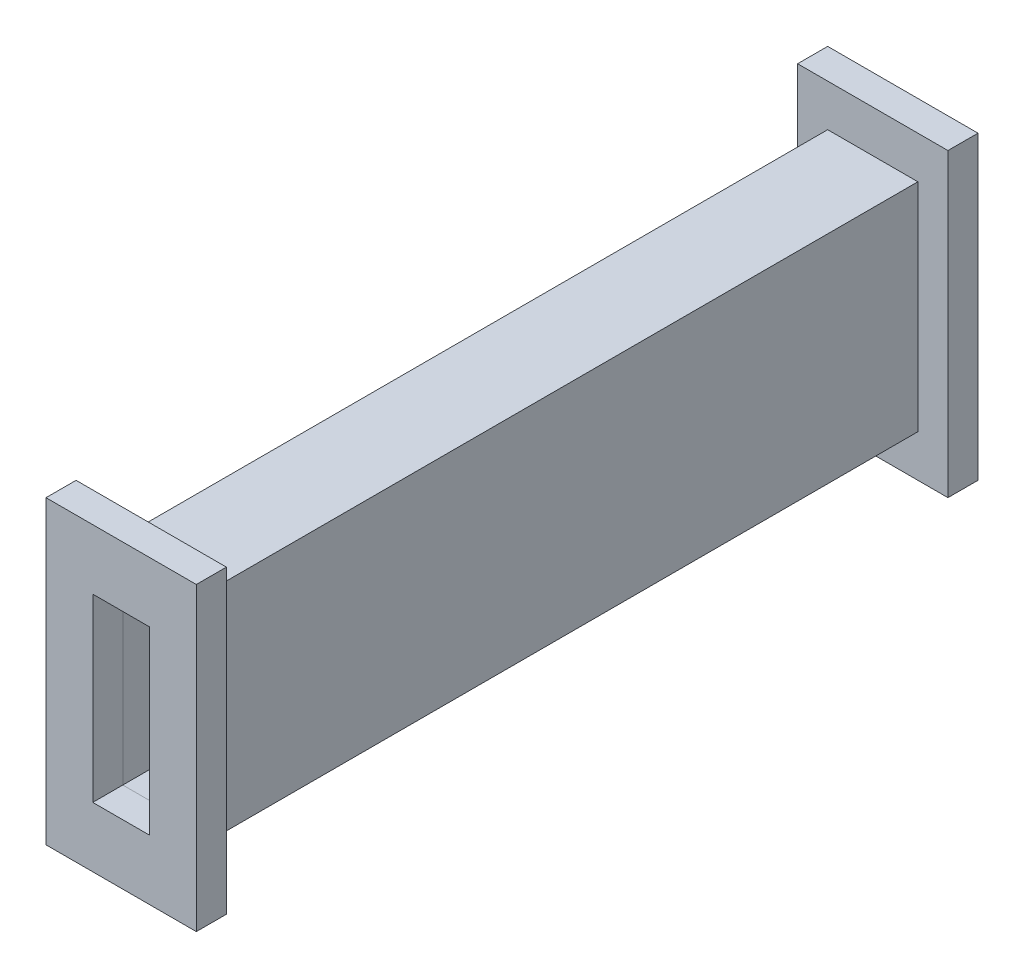
ISO-10303-21;
HEADER;
FILE_DESCRIPTION(('STEP AP214'),'2;1');
FILE_NAME('part.step','',(''),(''),'','','');
FILE_SCHEMA(('AUTOMOTIVE_DESIGN { 1 0 10303 214 1 1 1 1 }'));
ENDSEC;
DATA;
#1=APPLICATION_CONTEXT('core data for automotive mechanical design processes');
#2=APPLICATION_PROTOCOL_DEFINITION('international standard','automotive_design',2000,#1);
#3=PRODUCT_CONTEXT('',#1,'mechanical');
#4=PRODUCT('Part','Part','',(#3));
#5=PRODUCT_RELATED_PRODUCT_CATEGORY('part','',(#4));
#6=PRODUCT_DEFINITION_FORMATION('','',#4);
#7=PRODUCT_DEFINITION_CONTEXT('part definition',#1,'design');
#8=PRODUCT_DEFINITION('design','',#6,#7);
#9=PRODUCT_DEFINITION_SHAPE('','',#8);
#10=(LENGTH_UNIT() NAMED_UNIT(*) SI_UNIT(.MILLI.,.METRE.));
#11=(NAMED_UNIT(*) PLANE_ANGLE_UNIT() SI_UNIT($,.RADIAN.));
#12=(NAMED_UNIT(*) SI_UNIT($,.STERADIAN.) SOLID_ANGLE_UNIT());
#13=UNCERTAINTY_MEASURE_WITH_UNIT(LENGTH_MEASURE(1.E-05),#10,'distance_accuracy_value','');
#14=(GEOMETRIC_REPRESENTATION_CONTEXT(3) GLOBAL_UNCERTAINTY_ASSIGNED_CONTEXT((#13)) GLOBAL_UNIT_ASSIGNED_CONTEXT((#10,
#11,#12)) REPRESENTATION_CONTEXT('',''));
#15=CARTESIAN_POINT('',(0.,0.,0.));
#16=DIRECTION('',(0.,0.,1.));
#17=DIRECTION('',(1.,0.,0.));
#18=AXIS2_PLACEMENT_3D('',#15,#16,#17);
#19=CARTESIAN_POINT('',(0.,0.,65.));
#20=DIRECTION('',(0.,0.,1.));
#21=DIRECTION('',(1.,0.,0.));
#22=AXIS2_PLACEMENT_3D('',#19,#20,#21);
#23=PLANE('',#22);
#24=DIRECTION('',(0.,-1.,0.));
#25=VECTOR('',#24,1.);
#26=CARTESIAN_POINT('',(-12.5,-25.,65.));
#27=LINE('',#26,#25);
#28=CARTESIAN_POINT('',(-12.5,25.,65.));
#29=VERTEX_POINT('',#28);
#30=CARTESIAN_POINT('',(-12.5,-25.,65.));
#31=VERTEX_POINT('',#30);
#32=EDGE_CURVE('E150',#29,#31,#27,.T.);
#33=ORIENTED_EDGE('',*,*,#32,.T.);
#34=DIRECTION('',(1.,0.,0.));
#35=VECTOR('',#34,1.);
#36=CARTESIAN_POINT('',(12.5,-25.,65.));
#37=LINE('',#36,#35);
#38=CARTESIAN_POINT('',(12.5,-25.,65.));
#39=VERTEX_POINT('',#38);
#40=EDGE_CURVE('E153',#31,#39,#37,.T.);
#41=ORIENTED_EDGE('',*,*,#40,.T.);
#42=DIRECTION('',(0.,1.,0.));
#43=VECTOR('',#42,1.);
#44=CARTESIAN_POINT('',(12.5,-25.,65.));
#45=LINE('',#44,#43);
#46=CARTESIAN_POINT('',(12.5,25.,65.));
#47=VERTEX_POINT('',#46);
#48=EDGE_CURVE('E156',#39,#47,#45,.T.);
#49=ORIENTED_EDGE('',*,*,#48,.T.);
#50=DIRECTION('',(-1.,0.,0.));
#51=VECTOR('',#50,1.);
#52=CARTESIAN_POINT('',(12.5,25.,65.));
#53=LINE('',#52,#51);
#54=EDGE_CURVE('E158',#47,#29,#53,.T.);
#55=ORIENTED_EDGE('',*,*,#54,.T.);
#56=EDGE_LOOP('',(#33,#41,#49,#55));
#57=FACE_BOUND('',#56,.T.);
#58=DIRECTION('',(1.,0.,0.));
#59=VECTOR('',#58,1.);
#60=CARTESIAN_POINT('',(4.72499999999999,-15.,65.));
#61=LINE('',#60,#59);
#62=CARTESIAN_POINT('',(-4.725,-15.,65.));
#63=VERTEX_POINT('',#62);
#64=CARTESIAN_POINT('',(4.72499999999999,-15.,65.));
#65=VERTEX_POINT('',#64);
#66=EDGE_CURVE('E122',#63,#65,#61,.T.);
#67=ORIENTED_EDGE('',*,*,#66,.F.);
#68=DIRECTION('',(0.,-1.,0.));
#69=VECTOR('',#68,1.);
#70=CARTESIAN_POINT('',(-4.725,-15.,65.));
#71=LINE('',#70,#69);
#72=CARTESIAN_POINT('',(-4.725,15.,65.));
#73=VERTEX_POINT('',#72);
#74=EDGE_CURVE('E114',#73,#63,#71,.T.);
#75=ORIENTED_EDGE('',*,*,#74,.F.);
#76=DIRECTION('',(-1.,0.,0.));
#77=VECTOR('',#76,1.);
#78=CARTESIAN_POINT('',(4.72499999999999,15.,65.));
#79=LINE('',#78,#77);
#80=CARTESIAN_POINT('',(4.72499999999999,15.,65.));
#81=VERTEX_POINT('',#80);
#82=EDGE_CURVE('E136',#81,#73,#79,.T.);
#83=ORIENTED_EDGE('',*,*,#82,.F.);
#84=DIRECTION('',(0.,1.,0.));
#85=VECTOR('',#84,1.);
#86=CARTESIAN_POINT('',(4.72499999999999,-15.,65.));
#87=LINE('',#86,#85);
#88=EDGE_CURVE('E134',#65,#81,#87,.T.);
#89=ORIENTED_EDGE('',*,*,#88,.F.);
#90=EDGE_LOOP('',(#67,#75,#83,#89));
#91=FACE_BOUND('',#90,.T.);
#92=ADVANCED_FACE('F49',(#57,#91),#23,.T.);
#93=CARTESIAN_POINT('',(0.,0.,60.));
#94=DIRECTION('',(0.,0.,1.));
#95=DIRECTION('',(1.,0.,0.));
#96=AXIS2_PLACEMENT_3D('',#93,#94,#95);
#97=PLANE('',#96);
#98=DIRECTION('',(0.,-1.,0.));
#99=VECTOR('',#98,1.);
#100=CARTESIAN_POINT('',(-12.5,-25.,60.));
#101=LINE('',#100,#99);
#102=CARTESIAN_POINT('',(-12.5,25.,60.));
#103=VERTEX_POINT('',#102);
#104=CARTESIAN_POINT('',(-12.5,-25.,60.));
#105=VERTEX_POINT('',#104);
#106=EDGE_CURVE('E130',#103,#105,#101,.T.);
#107=ORIENTED_EDGE('',*,*,#106,.F.);
#108=DIRECTION('',(-1.,0.,0.));
#109=VECTOR('',#108,1.);
#110=CARTESIAN_POINT('',(12.5,25.,60.));
#111=LINE('',#110,#109);
#112=CARTESIAN_POINT('',(12.5,25.,60.));
#113=VERTEX_POINT('',#112);
#114=EDGE_CURVE('E154',#113,#103,#111,.T.);
#115=ORIENTED_EDGE('',*,*,#114,.F.);
#116=DIRECTION('',(0.,1.,0.));
#117=VECTOR('',#116,1.);
#118=CARTESIAN_POINT('',(12.5,-25.,60.));
#119=LINE('',#118,#117);
#120=CARTESIAN_POINT('',(12.5,-25.,60.));
#121=VERTEX_POINT('',#120);
#122=EDGE_CURVE('E165',#121,#113,#119,.T.);
#123=ORIENTED_EDGE('',*,*,#122,.F.);
#124=DIRECTION('',(1.,0.,0.));
#125=VECTOR('',#124,1.);
#126=CARTESIAN_POINT('',(12.5,-25.,60.));
#127=LINE('',#126,#125);
#128=EDGE_CURVE('E163',#105,#121,#127,.T.);
#129=ORIENTED_EDGE('',*,*,#128,.F.);
#130=EDGE_LOOP('',(#107,#115,#123,#129));
#131=FACE_BOUND('',#130,.T.);
#132=DIRECTION('',(0.,-1.,0.));
#133=VECTOR('',#132,1.);
#134=CARTESIAN_POINT('',(-4.725,-15.,60.));
#135=LINE('',#134,#133);
#136=CARTESIAN_POINT('',(-4.725,15.,60.));
#137=VERTEX_POINT('',#136);
#138=CARTESIAN_POINT('',(-4.725,-15.,60.));
#139=VERTEX_POINT('',#138);
#140=EDGE_CURVE('E72',#137,#139,#135,.T.);
#141=ORIENTED_EDGE('',*,*,#140,.T.);
#142=DIRECTION('',(1.,0.,0.));
#143=VECTOR('',#142,1.);
#144=CARTESIAN_POINT('',(4.72499999999999,-15.,60.));
#145=LINE('',#144,#143);
#146=CARTESIAN_POINT('',(4.72499999999999,-15.,60.));
#147=VERTEX_POINT('',#146);
#148=EDGE_CURVE('E129',#139,#147,#145,.T.);
#149=ORIENTED_EDGE('',*,*,#148,.T.);
#150=DIRECTION('',(0.,1.,0.));
#151=VECTOR('',#150,1.);
#152=CARTESIAN_POINT('',(4.72499999999999,-15.,60.));
#153=LINE('',#152,#151);
#154=CARTESIAN_POINT('',(4.72499999999999,15.,60.));
#155=VERTEX_POINT('',#154);
#156=EDGE_CURVE('E142',#147,#155,#153,.T.);
#157=ORIENTED_EDGE('',*,*,#156,.T.);
#158=DIRECTION('',(-1.,0.,0.));
#159=VECTOR('',#158,1.);
#160=CARTESIAN_POINT('',(4.72499999999999,15.,60.));
#161=LINE('',#160,#159);
#162=EDGE_CURVE('E123',#155,#137,#161,.T.);
#163=ORIENTED_EDGE('',*,*,#162,.T.);
#164=EDGE_LOOP('',(#141,#149,#157,#163));
#165=FACE_BOUND('',#164,.T.);
#166=ADVANCED_FACE('F183',(#131,#165),#97,.F.);
#167=CARTESIAN_POINT('',(-12.5,-25.,65.));
#168=DIRECTION('',(1.,0.,0.));
#169=DIRECTION('',(0.,0.,-1.));
#170=AXIS2_PLACEMENT_3D('',#167,#168,#169);
#171=PLANE('',#170);
#172=ORIENTED_EDGE('',*,*,#106,.T.);
#173=DIRECTION('',(0.,0.,-1.));
#174=VECTOR('',#173,1.);
#175=CARTESIAN_POINT('',(-12.5,-25.,65.));
#176=LINE('',#175,#174);
#177=EDGE_CURVE('E12',#31,#105,#176,.T.);
#178=ORIENTED_EDGE('',*,*,#177,.F.);
#179=ORIENTED_EDGE('',*,*,#32,.F.);
#180=DIRECTION('',(0.,0.,-1.));
#181=VECTOR('',#180,1.);
#182=CARTESIAN_POINT('',(-12.5,25.,65.));
#183=LINE('',#182,#181);
#184=EDGE_CURVE('E160',#29,#103,#183,.T.);
#185=ORIENTED_EDGE('',*,*,#184,.T.);
#186=EDGE_LOOP('',(#172,#178,#179,#185));
#187=FACE_BOUND('',#186,.T.);
#188=ADVANCED_FACE('F51',(#187),#171,.F.);
#189=CARTESIAN_POINT('',(12.5,-25.,65.));
#190=DIRECTION('',(0.,1.,0.));
#191=DIRECTION('',(-1.,0.,0.));
#192=AXIS2_PLACEMENT_3D('',#189,#190,#191);
#193=PLANE('',#192);
#194=ORIENTED_EDGE('',*,*,#128,.T.);
#195=DIRECTION('',(0.,0.,-1.));
#196=VECTOR('',#195,1.);
#197=CARTESIAN_POINT('',(12.5,-25.,65.));
#198=LINE('',#197,#196);
#199=EDGE_CURVE('E57',#39,#121,#198,.T.);
#200=ORIENTED_EDGE('',*,*,#199,.F.);
#201=ORIENTED_EDGE('',*,*,#40,.F.);
#202=ORIENTED_EDGE('',*,*,#177,.T.);
#203=EDGE_LOOP('',(#194,#200,#201,#202));
#204=FACE_BOUND('',#203,.T.);
#205=ADVANCED_FACE('F193',(#204),#193,.F.);
#206=CARTESIAN_POINT('',(12.5,-25.,65.));
#207=DIRECTION('',(-1.,0.,0.));
#208=DIRECTION('',(0.,-1.,0.));
#209=AXIS2_PLACEMENT_3D('',#206,#207,#208);
#210=PLANE('',#209);
#211=ORIENTED_EDGE('',*,*,#122,.T.);
#212=DIRECTION('',(0.,0.,-1.));
#213=VECTOR('',#212,1.);
#214=CARTESIAN_POINT('',(12.5,25.,65.));
#215=LINE('',#214,#213);
#216=EDGE_CURVE('E170',#47,#113,#215,.T.);
#217=ORIENTED_EDGE('',*,*,#216,.F.);
#218=ORIENTED_EDGE('',*,*,#48,.F.);
#219=ORIENTED_EDGE('',*,*,#199,.T.);
#220=EDGE_LOOP('',(#211,#217,#218,#219));
#221=FACE_BOUND('',#220,.T.);
#222=ADVANCED_FACE('F177',(#221),#210,.F.);
#223=CARTESIAN_POINT('',(12.5,25.,65.));
#224=DIRECTION('',(0.,-1.,0.));
#225=DIRECTION('',(1.,0.,0.));
#226=AXIS2_PLACEMENT_3D('',#223,#224,#225);
#227=PLANE('',#226);
#228=ORIENTED_EDGE('',*,*,#114,.T.);
#229=ORIENTED_EDGE('',*,*,#184,.F.);
#230=ORIENTED_EDGE('',*,*,#54,.F.);
#231=ORIENTED_EDGE('',*,*,#216,.T.);
#232=EDGE_LOOP('',(#228,#229,#230,#231));
#233=FACE_BOUND('',#232,.T.);
#234=ADVANCED_FACE('F187',(#233),#227,.F.);
#235=CARTESIAN_POINT('',(-4.725,-15.,65.));
#236=DIRECTION('',(1.,0.,0.));
#237=DIRECTION('',(0.,0.,-1.));
#238=AXIS2_PLACEMENT_3D('',#235,#236,#237);
#239=PLANE('',#238);
#240=ORIENTED_EDGE('',*,*,#140,.F.);
#241=DIRECTION('',(0.,0.,-1.));
#242=VECTOR('',#241,1.);
#243=CARTESIAN_POINT('',(-4.725,15.,65.));
#244=LINE('',#243,#242);
#245=EDGE_CURVE('E118',#73,#137,#244,.T.);
#246=ORIENTED_EDGE('',*,*,#245,.F.);
#247=ORIENTED_EDGE('',*,*,#74,.T.);
#248=DIRECTION('',(0.,0.,-1.));
#249=VECTOR('',#248,1.);
#250=CARTESIAN_POINT('',(-4.725,-15.,65.));
#251=LINE('',#250,#249);
#252=EDGE_CURVE('E117',#63,#139,#251,.T.);
#253=ORIENTED_EDGE('',*,*,#252,.T.);
#254=EDGE_LOOP('',(#240,#246,#247,#253));
#255=FACE_BOUND('',#254,.T.);
#256=ADVANCED_FACE('F116',(#255),#239,.T.);
#257=CARTESIAN_POINT('',(4.72499999999999,-15.,65.));
#258=DIRECTION('',(0.,1.,0.));
#259=DIRECTION('',(0.,0.,1.));
#260=AXIS2_PLACEMENT_3D('',#257,#258,#259);
#261=PLANE('',#260);
#262=ORIENTED_EDGE('',*,*,#148,.F.);
#263=ORIENTED_EDGE('',*,*,#252,.F.);
#264=ORIENTED_EDGE('',*,*,#66,.T.);
#265=DIRECTION('',(0.,0.,-1.));
#266=VECTOR('',#265,1.);
#267=CARTESIAN_POINT('',(4.72499999999999,-15.,65.));
#268=LINE('',#267,#266);
#269=EDGE_CURVE('E131',#65,#147,#268,.T.);
#270=ORIENTED_EDGE('',*,*,#269,.T.);
#271=EDGE_LOOP('',(#262,#263,#264,#270));
#272=FACE_BOUND('',#271,.T.);
#273=ADVANCED_FACE('F126',(#272),#261,.T.);
#274=CARTESIAN_POINT('',(4.72499999999999,-15.,65.));
#275=DIRECTION('',(-1.,0.,0.));
#276=DIRECTION('',(0.,0.,1.));
#277=AXIS2_PLACEMENT_3D('',#274,#275,#276);
#278=PLANE('',#277);
#279=ORIENTED_EDGE('',*,*,#156,.F.);
#280=ORIENTED_EDGE('',*,*,#269,.F.);
#281=ORIENTED_EDGE('',*,*,#88,.T.);
#282=DIRECTION('',(0.,0.,-1.));
#283=VECTOR('',#282,1.);
#284=CARTESIAN_POINT('',(4.72499999999999,15.,65.));
#285=LINE('',#284,#283);
#286=EDGE_CURVE('E64',#81,#155,#285,.T.);
#287=ORIENTED_EDGE('',*,*,#286,.T.);
#288=EDGE_LOOP('',(#279,#280,#281,#287));
#289=FACE_BOUND('',#288,.T.);
#290=ADVANCED_FACE('F216',(#289),#278,.T.);
#291=CARTESIAN_POINT('',(4.72499999999999,15.,65.));
#292=DIRECTION('',(0.,-1.,0.));
#293=DIRECTION('',(0.,0.,-1.));
#294=AXIS2_PLACEMENT_3D('',#291,#292,#293);
#295=PLANE('',#294);
#296=ORIENTED_EDGE('',*,*,#162,.F.);
#297=ORIENTED_EDGE('',*,*,#286,.F.);
#298=ORIENTED_EDGE('',*,*,#82,.T.);
#299=ORIENTED_EDGE('',*,*,#245,.T.);
#300=EDGE_LOOP('',(#296,#297,#298,#299));
#301=FACE_BOUND('',#300,.T.);
#302=ADVANCED_FACE('F220',(#301),#295,.T.);
#303=CLOSED_SHELL('',(#92,#166,#188,#205,#222,#234,#256,#273,#290,#302));
#304=MANIFOLD_SOLID_BREP('B2',#303);
#305=CARTESIAN_POINT('',(0.,0.,60.));
#306=DIRECTION('',(0.,0.,1.));
#307=DIRECTION('',(1.,0.,0.));
#308=AXIS2_PLACEMENT_3D('',#305,#306,#307);
#309=PLANE('',#308);
#310=DIRECTION('',(0.,1.,0.));
#311=VECTOR('',#310,1.);
#312=CARTESIAN_POINT('',(7.5,18.,60.));
#313=LINE('',#312,#311);
#314=CARTESIAN_POINT('',(7.5,-18.,60.));
#315=VERTEX_POINT('',#314);
#316=CARTESIAN_POINT('',(7.5,18.,60.));
#317=VERTEX_POINT('',#316);
#318=EDGE_CURVE('E339',#315,#317,#313,.T.);
#319=ORIENTED_EDGE('',*,*,#318,.T.);
#320=DIRECTION('',(-1.,0.,0.));
#321=VECTOR('',#320,1.);
#322=CARTESIAN_POINT('',(-7.5,18.,60.));
#323=LINE('',#322,#321);
#324=CARTESIAN_POINT('',(-7.5,18.,60.));
#325=VERTEX_POINT('',#324);
#326=EDGE_CURVE('E332',#317,#325,#323,.T.);
#327=ORIENTED_EDGE('',*,*,#326,.T.);
#328=DIRECTION('',(0.,-1.,0.));
#329=VECTOR('',#328,1.);
#330=CARTESIAN_POINT('',(-7.5,18.,60.));
#331=LINE('',#330,#329);
#332=CARTESIAN_POINT('',(-7.5,-18.,60.));
#333=VERTEX_POINT('',#332);
#334=EDGE_CURVE('E336',#325,#333,#331,.T.);
#335=ORIENTED_EDGE('',*,*,#334,.T.);
#336=DIRECTION('',(1.,0.,0.));
#337=VECTOR('',#336,1.);
#338=CARTESIAN_POINT('',(-7.5,-18.,60.));
#339=LINE('',#338,#337);
#340=EDGE_CURVE('E304',#333,#315,#339,.T.);
#341=ORIENTED_EDGE('',*,*,#340,.T.);
#342=EDGE_LOOP('',(#319,#327,#335,#341));
#343=FACE_BOUND('',#342,.T.);
#344=DIRECTION('',(-1.,0.,0.));
#345=VECTOR('',#344,1.);
#346=CARTESIAN_POINT('',(-4.725,15.,60.));
#347=LINE('',#346,#345);
#348=CARTESIAN_POINT('',(4.725,15.,60.));
#349=VERTEX_POINT('',#348);
#350=CARTESIAN_POINT('',(-4.725,15.,60.));
#351=VERTEX_POINT('',#350);
#352=EDGE_CURVE('E400',#349,#351,#347,.T.);
#353=ORIENTED_EDGE('',*,*,#352,.F.);
#354=DIRECTION('',(0.,1.,0.));
#355=VECTOR('',#354,1.);
#356=CARTESIAN_POINT('',(4.725,15.,60.));
#357=LINE('',#356,#355);
#358=CARTESIAN_POINT('',(4.725,-15.,60.));
#359=VERTEX_POINT('',#358);
#360=EDGE_CURVE('E391',#359,#349,#357,.T.);
#361=ORIENTED_EDGE('',*,*,#360,.F.);
#362=DIRECTION('',(1.,0.,0.));
#363=VECTOR('',#362,1.);
#364=CARTESIAN_POINT('',(-4.725,-15.,60.));
#365=LINE('',#364,#363);
#366=CARTESIAN_POINT('',(-4.725,-15.,60.));
#367=VERTEX_POINT('',#366);
#368=EDGE_CURVE('E325',#367,#359,#365,.T.);
#369=ORIENTED_EDGE('',*,*,#368,.F.);
#370=DIRECTION('',(0.,-1.,0.));
#371=VECTOR('',#370,1.);
#372=CARTESIAN_POINT('',(-4.725,15.,60.));
#373=LINE('',#372,#371);
#374=EDGE_CURVE('E414',#351,#367,#373,.T.);
#375=ORIENTED_EDGE('',*,*,#374,.F.);
#376=EDGE_LOOP('',(#353,#361,#369,#375));
#377=FACE_BOUND('',#376,.T.);
#378=ADVANCED_FACE('F279',(#343,#377),#309,.T.);
#379=CARTESIAN_POINT('',(7.5,18.,60.));
#380=DIRECTION('',(-1.,0.,0.));
#381=DIRECTION('',(0.,-1.,0.));
#382=AXIS2_PLACEMENT_3D('',#379,#380,#381);
#383=PLANE('',#382);
#384=DIRECTION('',(0.,1.,0.));
#385=VECTOR('',#384,1.);
#386=CARTESIAN_POINT('',(7.5,18.,-60.));
#387=LINE('',#386,#385);
#388=CARTESIAN_POINT('',(7.5,-18.,-60.));
#389=VERTEX_POINT('',#388);
#390=CARTESIAN_POINT('',(7.5,18.,-60.));
#391=VERTEX_POINT('',#390);
#392=EDGE_CURVE('E359',#389,#391,#387,.T.);
#393=ORIENTED_EDGE('',*,*,#392,.T.);
#394=DIRECTION('',(0.,0.,-1.));
#395=VECTOR('',#394,1.);
#396=CARTESIAN_POINT('',(7.5,18.,60.));
#397=LINE('',#396,#395);
#398=EDGE_CURVE('E47',#317,#391,#397,.T.);
#399=ORIENTED_EDGE('',*,*,#398,.F.);
#400=ORIENTED_EDGE('',*,*,#318,.F.);
#401=DIRECTION('',(0.,0.,-1.));
#402=VECTOR('',#401,1.);
#403=CARTESIAN_POINT('',(7.5,-18.,60.));
#404=LINE('',#403,#402);
#405=EDGE_CURVE('E355',#315,#389,#404,.T.);
#406=ORIENTED_EDGE('',*,*,#405,.T.);
#407=EDGE_LOOP('',(#393,#399,#400,#406));
#408=FACE_BOUND('',#407,.T.);
#409=ADVANCED_FACE('F281',(#408),#383,.F.);
#410=CARTESIAN_POINT('',(-7.5,18.,60.));
#411=DIRECTION('',(0.,-1.,0.));
#412=DIRECTION('',(0.,0.,-1.));
#413=AXIS2_PLACEMENT_3D('',#410,#411,#412);
#414=PLANE('',#413);
#415=DIRECTION('',(-1.,0.,0.));
#416=VECTOR('',#415,1.);
#417=CARTESIAN_POINT('',(-7.5,18.,-60.));
#418=LINE('',#417,#416);
#419=CARTESIAN_POINT('',(-7.5,18.,-60.));
#420=VERTEX_POINT('',#419);
#421=EDGE_CURVE('E346',#391,#420,#418,.T.);
#422=ORIENTED_EDGE('',*,*,#421,.T.);
#423=DIRECTION('',(0.,0.,-1.));
#424=VECTOR('',#423,1.);
#425=CARTESIAN_POINT('',(-7.5,18.,60.));
#426=LINE('',#425,#424);
#427=EDGE_CURVE('E288',#325,#420,#426,.T.);
#428=ORIENTED_EDGE('',*,*,#427,.F.);
#429=ORIENTED_EDGE('',*,*,#326,.F.);
#430=ORIENTED_EDGE('',*,*,#398,.T.);
#431=EDGE_LOOP('',(#422,#428,#429,#430));
#432=FACE_BOUND('',#431,.T.);
#433=ADVANCED_FACE('F345',(#432),#414,.F.);
#434=CARTESIAN_POINT('',(-7.5,18.,60.));
#435=DIRECTION('',(1.,0.,0.));
#436=DIRECTION('',(0.,1.,0.));
#437=AXIS2_PLACEMENT_3D('',#434,#435,#436);
#438=PLANE('',#437);
#439=DIRECTION('',(0.,-1.,0.));
#440=VECTOR('',#439,1.);
#441=CARTESIAN_POINT('',(-7.5,18.,-60.));
#442=LINE('',#441,#440);
#443=CARTESIAN_POINT('',(-7.5,-18.,-60.));
#444=VERTEX_POINT('',#443);
#445=EDGE_CURVE('E317',#420,#444,#442,.T.);
#446=ORIENTED_EDGE('',*,*,#445,.T.);
#447=DIRECTION('',(0.,0.,-1.));
#448=VECTOR('',#447,1.);
#449=CARTESIAN_POINT('',(-7.5,-18.,60.));
#450=LINE('',#449,#448);
#451=EDGE_CURVE('E349',#333,#444,#450,.T.);
#452=ORIENTED_EDGE('',*,*,#451,.F.);
#453=ORIENTED_EDGE('',*,*,#334,.F.);
#454=ORIENTED_EDGE('',*,*,#427,.T.);
#455=EDGE_LOOP('',(#446,#452,#453,#454));
#456=FACE_BOUND('',#455,.T.);
#457=ADVANCED_FACE('F350',(#456),#438,.F.);
#458=CARTESIAN_POINT('',(-7.5,-18.,60.));
#459=DIRECTION('',(0.,1.,0.));
#460=DIRECTION('',(0.,0.,1.));
#461=AXIS2_PLACEMENT_3D('',#458,#459,#460);
#462=PLANE('',#461);
#463=DIRECTION('',(1.,0.,0.));
#464=VECTOR('',#463,1.);
#465=CARTESIAN_POINT('',(-7.5,-18.,-60.));
#466=LINE('',#465,#464);
#467=EDGE_CURVE('E368',#444,#389,#466,.T.);
#468=ORIENTED_EDGE('',*,*,#467,.T.);
#469=ORIENTED_EDGE('',*,*,#405,.F.);
#470=ORIENTED_EDGE('',*,*,#340,.F.);
#471=ORIENTED_EDGE('',*,*,#451,.T.);
#472=EDGE_LOOP('',(#468,#469,#470,#471));
#473=FACE_BOUND('',#472,.T.);
#474=ADVANCED_FACE('F378',(#473),#462,.F.);
#475=CARTESIAN_POINT('',(4.725,15.,60.));
#476=DIRECTION('',(-1.,0.,0.));
#477=DIRECTION('',(0.,-1.,0.));
#478=AXIS2_PLACEMENT_3D('',#475,#476,#477);
#479=PLANE('',#478);
#480=DIRECTION('',(0.,0.,-1.));
#481=VECTOR('',#480,1.);
#482=CARTESIAN_POINT('',(4.725,15.,60.));
#483=LINE('',#482,#481);
#484=CARTESIAN_POINT('',(4.72499999999999,15.,-65.));
#485=VERTEX_POINT('',#484);
#486=EDGE_CURVE('E363',#349,#485,#483,.T.);
#487=ORIENTED_EDGE('',*,*,#486,.T.);
#488=DIRECTION('',(0.,1.,0.));
#489=VECTOR('',#488,1.);
#490=CARTESIAN_POINT('',(4.72499999999999,-15.,-65.));
#491=LINE('',#490,#489);
#492=CARTESIAN_POINT('',(4.72499999999999,-15.,-65.));
#493=VERTEX_POINT('',#492);
#494=EDGE_CURVE('E443',#493,#485,#491,.T.);
#495=ORIENTED_EDGE('',*,*,#494,.F.);
#496=DIRECTION('',(0.,0.,-1.));
#497=VECTOR('',#496,1.);
#498=CARTESIAN_POINT('',(4.725,-15.,60.));
#499=LINE('',#498,#497);
#500=EDGE_CURVE('E397',#359,#493,#499,.T.);
#501=ORIENTED_EDGE('',*,*,#500,.F.);
#502=ORIENTED_EDGE('',*,*,#360,.T.);
#503=EDGE_LOOP('',(#487,#495,#501,#502));
#504=FACE_BOUND('',#503,.T.);
#505=ADVANCED_FACE('F393',(#504),#479,.T.);
#506=CARTESIAN_POINT('',(-4.725,15.,60.));
#507=DIRECTION('',(0.,-1.,0.));
#508=DIRECTION('',(0.,0.,-1.));
#509=AXIS2_PLACEMENT_3D('',#506,#507,#508);
#510=PLANE('',#509);
#511=DIRECTION('',(0.,0.,-1.));
#512=VECTOR('',#511,1.);
#513=CARTESIAN_POINT('',(-4.725,15.,60.));
#514=LINE('',#513,#512);
#515=CARTESIAN_POINT('',(-4.725,15.,-65.));
#516=VERTEX_POINT('',#515);
#517=EDGE_CURVE('E411',#351,#516,#514,.T.);
#518=ORIENTED_EDGE('',*,*,#517,.T.);
#519=DIRECTION('',(-1.,0.,0.));
#520=VECTOR('',#519,1.);
#521=CARTESIAN_POINT('',(4.72499999999999,15.,-65.));
#522=LINE('',#521,#520);
#523=EDGE_CURVE('E408',#485,#516,#522,.T.);
#524=ORIENTED_EDGE('',*,*,#523,.F.);
#525=ORIENTED_EDGE('',*,*,#486,.F.);
#526=ORIENTED_EDGE('',*,*,#352,.T.);
#527=EDGE_LOOP('',(#518,#524,#525,#526));
#528=FACE_BOUND('',#527,.T.);
#529=ADVANCED_FACE('F405',(#528),#510,.T.);
#530=CARTESIAN_POINT('',(-4.725,15.,60.));
#531=DIRECTION('',(1.,0.,0.));
#532=DIRECTION('',(0.,1.,0.));
#533=AXIS2_PLACEMENT_3D('',#530,#531,#532);
#534=PLANE('',#533);
#535=DIRECTION('',(0.,0.,-1.));
#536=VECTOR('',#535,1.);
#537=CARTESIAN_POINT('',(-4.725,-15.,60.));
#538=LINE('',#537,#536);
#539=CARTESIAN_POINT('',(-4.725,-15.,-65.));
#540=VERTEX_POINT('',#539);
#541=EDGE_CURVE('E295',#367,#540,#538,.T.);
#542=ORIENTED_EDGE('',*,*,#541,.T.);
#543=DIRECTION('',(0.,-1.,0.));
#544=VECTOR('',#543,1.);
#545=CARTESIAN_POINT('',(-4.725,-15.,-65.));
#546=LINE('',#545,#544);
#547=EDGE_CURVE('E435',#516,#540,#546,.T.);
#548=ORIENTED_EDGE('',*,*,#547,.F.);
#549=ORIENTED_EDGE('',*,*,#517,.F.);
#550=ORIENTED_EDGE('',*,*,#374,.T.);
#551=EDGE_LOOP('',(#542,#548,#549,#550));
#552=FACE_BOUND('',#551,.T.);
#553=ADVANCED_FACE('F436',(#552),#534,.T.);
#554=CARTESIAN_POINT('',(-4.725,-15.,60.));
#555=DIRECTION('',(0.,1.,0.));
#556=DIRECTION('',(0.,0.,1.));
#557=AXIS2_PLACEMENT_3D('',#554,#555,#556);
#558=PLANE('',#557);
#559=ORIENTED_EDGE('',*,*,#500,.T.);
#560=DIRECTION('',(1.,0.,0.));
#561=VECTOR('',#560,1.);
#562=CARTESIAN_POINT('',(4.72499999999999,-15.,-65.));
#563=LINE('',#562,#561);
#564=EDGE_CURVE('E440',#540,#493,#563,.T.);
#565=ORIENTED_EDGE('',*,*,#564,.F.);
#566=ORIENTED_EDGE('',*,*,#541,.F.);
#567=ORIENTED_EDGE('',*,*,#368,.T.);
#568=EDGE_LOOP('',(#559,#565,#566,#567));
#569=FACE_BOUND('',#568,.T.);
#570=ADVANCED_FACE('F535',(#569),#558,.T.);
#571=CARTESIAN_POINT('',(0.,0.,-65.));
#572=DIRECTION('',(0.,0.,-1.));
#573=DIRECTION('',(1.,0.,0.));
#574=AXIS2_PLACEMENT_3D('',#571,#572,#573);
#575=PLANE('',#574);
#576=DIRECTION('',(0.,-1.,0.));
#577=VECTOR('',#576,1.);
#578=CARTESIAN_POINT('',(-12.5,-25.,-65.));
#579=LINE('',#578,#577);
#580=CARTESIAN_POINT('',(-12.5,25.,-65.));
#581=VERTEX_POINT('',#580);
#582=CARTESIAN_POINT('',(-12.5,-25.,-65.));
#583=VERTEX_POINT('',#582);
#584=EDGE_CURVE('E526',#581,#583,#579,.T.);
#585=ORIENTED_EDGE('',*,*,#584,.F.);
#586=DIRECTION('',(-1.,0.,0.));
#587=VECTOR('',#586,1.);
#588=CARTESIAN_POINT('',(12.5,25.,-65.));
#589=LINE('',#588,#587);
#590=CARTESIAN_POINT('',(12.5,25.,-65.));
#591=VERTEX_POINT('',#590);
#592=EDGE_CURVE('E528',#591,#581,#589,.T.);
#593=ORIENTED_EDGE('',*,*,#592,.F.);
#594=DIRECTION('',(0.,1.,0.));
#595=VECTOR('',#594,1.);
#596=CARTESIAN_POINT('',(12.5,-25.,-65.));
#597=LINE('',#596,#595);
#598=CARTESIAN_POINT('',(12.5,-25.,-65.));
#599=VERTEX_POINT('',#598);
#600=EDGE_CURVE('E490',#599,#591,#597,.T.);
#601=ORIENTED_EDGE('',*,*,#600,.F.);
#602=DIRECTION('',(1.,0.,0.));
#603=VECTOR('',#602,1.);
#604=CARTESIAN_POINT('',(12.5,-25.,-65.));
#605=LINE('',#604,#603);
#606=EDGE_CURVE('E522',#583,#599,#605,.T.);
#607=ORIENTED_EDGE('',*,*,#606,.F.);
#608=EDGE_LOOP('',(#585,#593,#601,#607));
#609=FACE_BOUND('',#608,.T.);
#610=ORIENTED_EDGE('',*,*,#564,.T.);
#611=ORIENTED_EDGE('',*,*,#494,.T.);
#612=ORIENTED_EDGE('',*,*,#523,.T.);
#613=ORIENTED_EDGE('',*,*,#547,.T.);
#614=EDGE_LOOP('',(#610,#611,#612,#613));
#615=FACE_BOUND('',#614,.T.);
#616=ADVANCED_FACE('F442',(#609,#615),#575,.T.);
#617=CARTESIAN_POINT('',(0.,0.,-60.));
#618=DIRECTION('',(0.,0.,-1.));
#619=DIRECTION('',(1.,0.,0.));
#620=AXIS2_PLACEMENT_3D('',#617,#618,#619);
#621=PLANE('',#620);
#622=ORIENTED_EDGE('',*,*,#392,.F.);
#623=ORIENTED_EDGE('',*,*,#467,.F.);
#624=ORIENTED_EDGE('',*,*,#445,.F.);
#625=ORIENTED_EDGE('',*,*,#421,.F.);
#626=EDGE_LOOP('',(#622,#623,#624,#625));
#627=FACE_BOUND('',#626,.T.);
#628=DIRECTION('',(0.,-1.,0.));
#629=VECTOR('',#628,1.);
#630=CARTESIAN_POINT('',(-12.5,-25.,-60.));
#631=LINE('',#630,#629);
#632=CARTESIAN_POINT('',(-12.5,25.,-60.));
#633=VERTEX_POINT('',#632);
#634=CARTESIAN_POINT('',(-12.5,-25.,-60.));
#635=VERTEX_POINT('',#634);
#636=EDGE_CURVE('E447',#633,#635,#631,.T.);
#637=ORIENTED_EDGE('',*,*,#636,.T.);
#638=DIRECTION('',(1.,0.,0.));
#639=VECTOR('',#638,1.);
#640=CARTESIAN_POINT('',(12.5,-25.,-60.));
#641=LINE('',#640,#639);
#642=CARTESIAN_POINT('',(12.5,-25.,-60.));
#643=VERTEX_POINT('',#642);
#644=EDGE_CURVE('E462',#635,#643,#641,.T.);
#645=ORIENTED_EDGE('',*,*,#644,.T.);
#646=DIRECTION('',(0.,1.,0.));
#647=VECTOR('',#646,1.);
#648=CARTESIAN_POINT('',(12.5,-25.,-60.));
#649=LINE('',#648,#647);
#650=CARTESIAN_POINT('',(12.5,25.,-60.));
#651=VERTEX_POINT('',#650);
#652=EDGE_CURVE('E458',#643,#651,#649,.T.);
#653=ORIENTED_EDGE('',*,*,#652,.T.);
#654=DIRECTION('',(-1.,0.,0.));
#655=VECTOR('',#654,1.);
#656=CARTESIAN_POINT('',(12.5,25.,-60.));
#657=LINE('',#656,#655);
#658=EDGE_CURVE('E454',#651,#633,#657,.T.);
#659=ORIENTED_EDGE('',*,*,#658,.T.);
#660=EDGE_LOOP('',(#637,#645,#653,#659));
#661=FACE_BOUND('',#660,.T.);
#662=ADVANCED_FACE('F500',(#627,#661),#621,.F.);
#663=CARTESIAN_POINT('',(-12.5,-25.,-65.));
#664=DIRECTION('',(1.,0.,0.));
#665=DIRECTION('',(0.,0.,1.));
#666=AXIS2_PLACEMENT_3D('',#663,#664,#665);
#667=PLANE('',#666);
#668=ORIENTED_EDGE('',*,*,#636,.F.);
#669=DIRECTION('',(0.,0.,1.));
#670=VECTOR('',#669,1.);
#671=CARTESIAN_POINT('',(-12.5,25.,-65.));
#672=LINE('',#671,#670);
#673=EDGE_CURVE('E470',#581,#633,#672,.T.);
#674=ORIENTED_EDGE('',*,*,#673,.F.);
#675=ORIENTED_EDGE('',*,*,#584,.T.);
#676=DIRECTION('',(0.,0.,1.));
#677=VECTOR('',#676,1.);
#678=CARTESIAN_POINT('',(-12.5,-25.,-65.));
#679=LINE('',#678,#677);
#680=EDGE_CURVE('E466',#583,#635,#679,.T.);
#681=ORIENTED_EDGE('',*,*,#680,.T.);
#682=EDGE_LOOP('',(#668,#674,#675,#681));
#683=FACE_BOUND('',#682,.T.);
#684=ADVANCED_FACE('F605',(#683),#667,.F.);
#685=CARTESIAN_POINT('',(12.5,-25.,-65.));
#686=DIRECTION('',(0.,1.,0.));
#687=DIRECTION('',(-1.,0.,0.));
#688=AXIS2_PLACEMENT_3D('',#685,#686,#687);
#689=PLANE('',#688);
#690=ORIENTED_EDGE('',*,*,#644,.F.);
#691=ORIENTED_EDGE('',*,*,#680,.F.);
#692=ORIENTED_EDGE('',*,*,#606,.T.);
#693=DIRECTION('',(0.,0.,1.));
#694=VECTOR('',#693,1.);
#695=CARTESIAN_POINT('',(12.5,-25.,-65.));
#696=LINE('',#695,#694);
#697=EDGE_CURVE('E474',#599,#643,#696,.T.);
#698=ORIENTED_EDGE('',*,*,#697,.T.);
#699=EDGE_LOOP('',(#690,#691,#692,#698));
#700=FACE_BOUND('',#699,.T.);
#701=ADVANCED_FACE('F505',(#700),#689,.F.);
#702=CARTESIAN_POINT('',(12.5,-25.,-65.));
#703=DIRECTION('',(-1.,0.,0.));
#704=DIRECTION('',(0.,-1.,0.));
#705=AXIS2_PLACEMENT_3D('',#702,#703,#704);
#706=PLANE('',#705);
#707=ORIENTED_EDGE('',*,*,#652,.F.);
#708=ORIENTED_EDGE('',*,*,#697,.F.);
#709=ORIENTED_EDGE('',*,*,#600,.T.);
#710=DIRECTION('',(0.,0.,1.));
#711=VECTOR('',#710,1.);
#712=CARTESIAN_POINT('',(12.5,25.,-65.));
#713=LINE('',#712,#711);
#714=EDGE_CURVE('E401',#591,#651,#713,.T.);
#715=ORIENTED_EDGE('',*,*,#714,.T.);
#716=EDGE_LOOP('',(#707,#708,#709,#715));
#717=FACE_BOUND('',#716,.T.);
#718=ADVANCED_FACE('F485',(#717),#706,.F.);
#719=CARTESIAN_POINT('',(12.5,25.,-65.));
#720=DIRECTION('',(0.,-1.,0.));
#721=DIRECTION('',(1.,0.,0.));
#722=AXIS2_PLACEMENT_3D('',#719,#720,#721);
#723=PLANE('',#722);
#724=ORIENTED_EDGE('',*,*,#658,.F.);
#725=ORIENTED_EDGE('',*,*,#714,.F.);
#726=ORIENTED_EDGE('',*,*,#592,.T.);
#727=ORIENTED_EDGE('',*,*,#673,.T.);
#728=EDGE_LOOP('',(#724,#725,#726,#727));
#729=FACE_BOUND('',#728,.T.);
#730=ADVANCED_FACE('F496',(#729),#723,.F.);
#731=CLOSED_SHELL('',(#378,#409,#433,#457,#474,#505,#529,#553,#570,#616,#662,#684,#701,#718,#730));
#732=MANIFOLD_SOLID_BREP('B6',#731);
#733=ADVANCED_BREP_SHAPE_REPRESENTATION('',(#18,#304,#732),#14);
#734=SHAPE_DEFINITION_REPRESENTATION(#9,#733);
ENDSEC;
END-ISO-10303-21;
